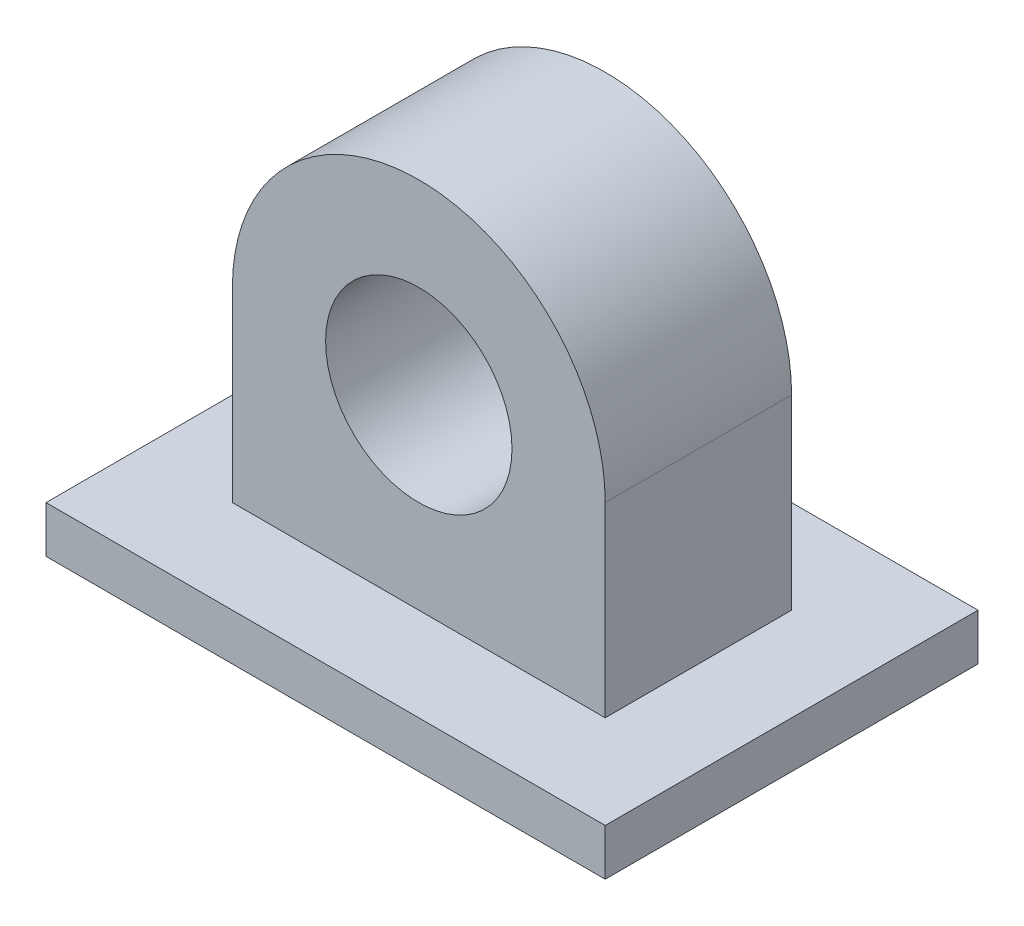
ISO-10303-21;
HEADER;
FILE_DESCRIPTION(('STEP AP214'),'2;1');
FILE_NAME('part.step','',(''),(''),'','','');
FILE_SCHEMA(('AUTOMOTIVE_DESIGN { 1 0 10303 214 1 1 1 1 }'));
ENDSEC;
DATA;
#1=APPLICATION_CONTEXT('core data for automotive mechanical design processes');
#2=APPLICATION_PROTOCOL_DEFINITION('international standard','automotive_design',2000,#1);
#3=PRODUCT_CONTEXT('',#1,'mechanical');
#4=PRODUCT('Part','Part','',(#3));
#5=PRODUCT_RELATED_PRODUCT_CATEGORY('part','',(#4));
#6=PRODUCT_DEFINITION_FORMATION('','',#4);
#7=PRODUCT_DEFINITION_CONTEXT('part definition',#1,'design');
#8=PRODUCT_DEFINITION('design','',#6,#7);
#9=PRODUCT_DEFINITION_SHAPE('','',#8);
#10=(LENGTH_UNIT() NAMED_UNIT(*) SI_UNIT(.MILLI.,.METRE.));
#11=(NAMED_UNIT(*) PLANE_ANGLE_UNIT() SI_UNIT($,.RADIAN.));
#12=(NAMED_UNIT(*) SI_UNIT($,.STERADIAN.) SOLID_ANGLE_UNIT());
#13=UNCERTAINTY_MEASURE_WITH_UNIT(LENGTH_MEASURE(1.E-05),#10,'distance_accuracy_value','');
#14=(GEOMETRIC_REPRESENTATION_CONTEXT(3) GLOBAL_UNCERTAINTY_ASSIGNED_CONTEXT((#13)) GLOBAL_UNIT_ASSIGNED_CONTEXT((#10,
#11,#12)) REPRESENTATION_CONTEXT('',''));
#15=CARTESIAN_POINT('',(0.,0.,0.));
#16=DIRECTION('',(0.,0.,1.));
#17=DIRECTION('',(1.,0.,0.));
#18=AXIS2_PLACEMENT_3D('',#15,#16,#17);
#19=CARTESIAN_POINT('',(38.1,6.35,25.4));
#20=DIRECTION('',(-1.,0.,0.));
#21=DIRECTION('',(0.,0.,1.));
#22=AXIS2_PLACEMENT_3D('',#19,#20,#21);
#23=PLANE('',#22);
#24=DIRECTION('',(0.,0.,-1.));
#25=VECTOR('',#24,1.);
#26=CARTESIAN_POINT('',(38.1,0.,25.4));
#27=LINE('',#26,#25);
#28=CARTESIAN_POINT('',(38.1,0.,25.4));
#29=VERTEX_POINT('',#28);
#30=CARTESIAN_POINT('',(38.1,0.,-25.4));
#31=VERTEX_POINT('',#30);
#32=EDGE_CURVE('E107',#29,#31,#27,.T.);
#33=ORIENTED_EDGE('',*,*,#32,.T.);
#34=DIRECTION('',(0.,-1.,0.));
#35=VECTOR('',#34,1.);
#36=CARTESIAN_POINT('',(38.1,6.35,-25.4));
#37=LINE('',#36,#35);
#38=CARTESIAN_POINT('',(38.1,6.35,-25.4));
#39=VERTEX_POINT('',#38);
#40=EDGE_CURVE('E11',#39,#31,#37,.T.);
#41=ORIENTED_EDGE('',*,*,#40,.F.);
#42=DIRECTION('',(0.,0.,-1.));
#43=VECTOR('',#42,1.);
#44=CARTESIAN_POINT('',(38.1,6.35,25.4));
#45=LINE('',#44,#43);
#46=CARTESIAN_POINT('',(38.1,6.35,25.4));
#47=VERTEX_POINT('',#46);
#48=EDGE_CURVE('E136',#47,#39,#45,.T.);
#49=ORIENTED_EDGE('',*,*,#48,.F.);
#50=DIRECTION('',(0.,-1.,0.));
#51=VECTOR('',#50,1.);
#52=CARTESIAN_POINT('',(38.1,6.35,25.4));
#53=LINE('',#52,#51);
#54=EDGE_CURVE('E146',#47,#29,#53,.T.);
#55=ORIENTED_EDGE('',*,*,#54,.T.);
#56=EDGE_LOOP('',(#33,#41,#49,#55));
#57=FACE_BOUND('',#56,.T.);
#58=ADVANCED_FACE('F34',(#57),#23,.F.);
#59=CARTESIAN_POINT('',(-38.1,6.35,-25.4));
#60=DIRECTION('',(0.,0.,1.));
#61=DIRECTION('',(1.,0.,0.));
#62=AXIS2_PLACEMENT_3D('',#59,#60,#61);
#63=PLANE('',#62);
#64=DIRECTION('',(-1.,0.,0.));
#65=VECTOR('',#64,1.);
#66=CARTESIAN_POINT('',(-38.1,0.,-25.4));
#67=LINE('',#66,#65);
#68=CARTESIAN_POINT('',(-38.1,0.,-25.4));
#69=VERTEX_POINT('',#68);
#70=EDGE_CURVE('E149',#31,#69,#67,.T.);
#71=ORIENTED_EDGE('',*,*,#70,.T.);
#72=DIRECTION('',(0.,-1.,0.));
#73=VECTOR('',#72,1.);
#74=CARTESIAN_POINT('',(-38.1,6.35,-25.4));
#75=LINE('',#74,#73);
#76=CARTESIAN_POINT('',(-38.1,6.35,-25.4));
#77=VERTEX_POINT('',#76);
#78=EDGE_CURVE('E42',#77,#69,#75,.T.);
#79=ORIENTED_EDGE('',*,*,#78,.F.);
#80=DIRECTION('',(-1.,0.,0.));
#81=VECTOR('',#80,1.);
#82=CARTESIAN_POINT('',(-38.1,6.35,-25.4));
#83=LINE('',#82,#81);
#84=EDGE_CURVE('E139',#39,#77,#83,.T.);
#85=ORIENTED_EDGE('',*,*,#84,.F.);
#86=ORIENTED_EDGE('',*,*,#40,.T.);
#87=EDGE_LOOP('',(#71,#79,#85,#86));
#88=FACE_BOUND('',#87,.T.);
#89=ADVANCED_FACE('F180',(#88),#63,.F.);
#90=CARTESIAN_POINT('',(-38.1,6.35,25.4));
#91=DIRECTION('',(1.,0.,0.));
#92=DIRECTION('',(0.,0.,-1.));
#93=AXIS2_PLACEMENT_3D('',#90,#91,#92);
#94=PLANE('',#93);
#95=DIRECTION('',(0.,0.,1.));
#96=VECTOR('',#95,1.);
#97=CARTESIAN_POINT('',(-38.1,0.,25.4));
#98=LINE('',#97,#96);
#99=CARTESIAN_POINT('',(-38.1,0.,25.4));
#100=VERTEX_POINT('',#99);
#101=EDGE_CURVE('E151',#69,#100,#98,.T.);
#102=ORIENTED_EDGE('',*,*,#101,.T.);
#103=DIRECTION('',(0.,-1.,0.));
#104=VECTOR('',#103,1.);
#105=CARTESIAN_POINT('',(-38.1,6.35,25.4));
#106=LINE('',#105,#104);
#107=CARTESIAN_POINT('',(-38.1,6.35,25.4));
#108=VERTEX_POINT('',#107);
#109=EDGE_CURVE('E156',#108,#100,#106,.T.);
#110=ORIENTED_EDGE('',*,*,#109,.F.);
#111=DIRECTION('',(0.,0.,1.));
#112=VECTOR('',#111,1.);
#113=CARTESIAN_POINT('',(-38.1,6.35,25.4));
#114=LINE('',#113,#112);
#115=EDGE_CURVE('E142',#77,#108,#114,.T.);
#116=ORIENTED_EDGE('',*,*,#115,.F.);
#117=ORIENTED_EDGE('',*,*,#78,.T.);
#118=EDGE_LOOP('',(#102,#110,#116,#117));
#119=FACE_BOUND('',#118,.T.);
#120=ADVANCED_FACE('F164',(#119),#94,.F.);
#121=CARTESIAN_POINT('',(-38.1,6.35,25.4));
#122=DIRECTION('',(0.,0.,-1.));
#123=DIRECTION('',(-1.,0.,0.));
#124=AXIS2_PLACEMENT_3D('',#121,#122,#123);
#125=PLANE('',#124);
#126=DIRECTION('',(1.,0.,0.));
#127=VECTOR('',#126,1.);
#128=CARTESIAN_POINT('',(-38.1,0.,25.4));
#129=LINE('',#128,#127);
#130=EDGE_CURVE('E140',#100,#29,#129,.T.);
#131=ORIENTED_EDGE('',*,*,#130,.T.);
#132=ORIENTED_EDGE('',*,*,#54,.F.);
#133=DIRECTION('',(1.,0.,0.));
#134=VECTOR('',#133,1.);
#135=CARTESIAN_POINT('',(-38.1,6.35,25.4));
#136=LINE('',#135,#134);
#137=EDGE_CURVE('E144',#108,#47,#136,.T.);
#138=ORIENTED_EDGE('',*,*,#137,.F.);
#139=ORIENTED_EDGE('',*,*,#109,.T.);
#140=EDGE_LOOP('',(#131,#132,#138,#139));
#141=FACE_BOUND('',#140,.T.);
#142=ADVANCED_FACE('F173',(#141),#125,.F.);
#143=CARTESIAN_POINT('',(0.,6.35,0.));
#144=DIRECTION('',(0.,-1.,0.));
#145=DIRECTION('',(0.,0.,-1.));
#146=AXIS2_PLACEMENT_3D('',#143,#144,#145);
#147=PLANE('',#146);
#148=DIRECTION('',(0.,0.,-1.));
#149=VECTOR('',#148,1.);
#150=CARTESIAN_POINT('',(25.4,6.35,12.7));
#151=LINE('',#150,#149);
#152=CARTESIAN_POINT('',(25.4,6.35,12.7));
#153=VERTEX_POINT('',#152);
#154=CARTESIAN_POINT('',(25.4,6.35,-12.7));
#155=VERTEX_POINT('',#154);
#156=EDGE_CURVE('E54',#153,#155,#151,.T.);
#157=ORIENTED_EDGE('',*,*,#156,.F.);
#158=DIRECTION('',(1.,0.,0.));
#159=VECTOR('',#158,1.);
#160=CARTESIAN_POINT('',(0.,6.35,12.7));
#161=LINE('',#160,#159);
#162=CARTESIAN_POINT('',(-25.4,6.35,12.7));
#163=VERTEX_POINT('',#162);
#164=EDGE_CURVE('E49',#163,#153,#161,.T.);
#165=ORIENTED_EDGE('',*,*,#164,.F.);
#166=DIRECTION('',(0.,0.,-1.));
#167=VECTOR('',#166,1.);
#168=CARTESIAN_POINT('',(-25.4,6.35,12.7));
#169=LINE('',#168,#167);
#170=CARTESIAN_POINT('',(-25.4,6.35,-12.7));
#171=VERTEX_POINT('',#170);
#172=EDGE_CURVE('E108',#163,#171,#169,.T.);
#173=ORIENTED_EDGE('',*,*,#172,.T.);
#174=DIRECTION('',(1.,0.,0.));
#175=VECTOR('',#174,1.);
#176=CARTESIAN_POINT('',(0.,6.35,-12.7));
#177=LINE('',#176,#175);
#178=EDGE_CURVE('E129',#171,#155,#177,.T.);
#179=ORIENTED_EDGE('',*,*,#178,.T.);
#180=EDGE_LOOP('',(#157,#165,#173,#179));
#181=FACE_BOUND('',#180,.T.);
#182=ORIENTED_EDGE('',*,*,#48,.T.);
#183=ORIENTED_EDGE('',*,*,#84,.T.);
#184=ORIENTED_EDGE('',*,*,#115,.T.);
#185=ORIENTED_EDGE('',*,*,#137,.T.);
#186=EDGE_LOOP('',(#182,#183,#184,#185));
#187=FACE_BOUND('',#186,.T.);
#188=ADVANCED_FACE('F179',(#181,#187),#147,.F.);
#189=CARTESIAN_POINT('',(0.,0.,0.));
#190=DIRECTION('',(0.,-1.,0.));
#191=DIRECTION('',(0.,0.,-1.));
#192=AXIS2_PLACEMENT_3D('',#189,#190,#191);
#193=PLANE('',#192);
#194=ORIENTED_EDGE('',*,*,#32,.F.);
#195=ORIENTED_EDGE('',*,*,#130,.F.);
#196=ORIENTED_EDGE('',*,*,#101,.F.);
#197=ORIENTED_EDGE('',*,*,#70,.F.);
#198=EDGE_LOOP('',(#194,#195,#196,#197));
#199=FACE_BOUND('',#198,.T.);
#200=ADVANCED_FACE('F170',(#199),#193,.T.);
#201=CARTESIAN_POINT('',(0.,31.75,12.7));
#202=DIRECTION('',(0.,0.,-1.));
#203=DIRECTION('',(-1.,0.,0.));
#204=AXIS2_PLACEMENT_3D('',#201,#202,#203);
#205=CYLINDRICAL_SURFACE('',#204,25.4);
#206=CARTESIAN_POINT('',(0.,31.75,-12.7));
#207=DIRECTION('',(0.,0.,1.));
#208=DIRECTION('',(1.,0.,0.));
#209=AXIS2_PLACEMENT_3D('',#206,#207,#208);
#210=CIRCLE('',#209,25.4);
#211=CARTESIAN_POINT('',(-25.4,31.75,-12.7));
#212=VERTEX_POINT('',#211);
#213=CARTESIAN_POINT('',(25.4,31.75,-12.7));
#214=VERTEX_POINT('',#213);
#215=EDGE_CURVE('E102',#212,#214,#210,.F.);
#216=ORIENTED_EDGE('',*,*,#215,.F.);
#217=DIRECTION('',(0.,0.,-1.));
#218=VECTOR('',#217,1.);
#219=CARTESIAN_POINT('',(-25.4,31.75,12.7));
#220=LINE('',#219,#218);
#221=CARTESIAN_POINT('',(-25.4,31.75,12.7));
#222=VERTEX_POINT('',#221);
#223=EDGE_CURVE('E97',#222,#212,#220,.T.);
#224=ORIENTED_EDGE('',*,*,#223,.F.);
#225=CARTESIAN_POINT('',(0.,31.75,12.7));
#226=DIRECTION('',(0.,0.,1.));
#227=DIRECTION('',(1.,0.,0.));
#228=AXIS2_PLACEMENT_3D('',#225,#226,#227);
#229=CIRCLE('',#228,25.4);
#230=CARTESIAN_POINT('',(25.4,31.75,12.7));
#231=VERTEX_POINT('',#230);
#232=EDGE_CURVE('E100',#222,#231,#229,.F.);
#233=ORIENTED_EDGE('',*,*,#232,.T.);
#234=DIRECTION('',(0.,0.,-1.));
#235=VECTOR('',#234,1.);
#236=CARTESIAN_POINT('',(25.4,31.75,12.7));
#237=LINE('',#236,#235);
#238=EDGE_CURVE('E125',#231,#214,#237,.T.);
#239=ORIENTED_EDGE('',*,*,#238,.T.);
#240=EDGE_LOOP('',(#216,#224,#233,#239));
#241=FACE_BOUND('',#240,.T.);
#242=ADVANCED_FACE('F99',(#241),#205,.T.);
#243=CARTESIAN_POINT('',(-25.4,0.,12.7));
#244=DIRECTION('',(-1.,0.,0.));
#245=DIRECTION('',(0.,0.,1.));
#246=AXIS2_PLACEMENT_3D('',#243,#244,#245);
#247=PLANE('',#246);
#248=DIRECTION('',(0.,1.,0.));
#249=VECTOR('',#248,1.);
#250=CARTESIAN_POINT('',(-25.4,0.,-12.7));
#251=LINE('',#250,#249);
#252=EDGE_CURVE('E127',#171,#212,#251,.T.);
#253=ORIENTED_EDGE('',*,*,#252,.F.);
#254=ORIENTED_EDGE('',*,*,#172,.F.);
#255=DIRECTION('',(0.,1.,0.));
#256=VECTOR('',#255,1.);
#257=CARTESIAN_POINT('',(-25.4,0.,12.7));
#258=LINE('',#257,#256);
#259=EDGE_CURVE('E113',#163,#222,#258,.T.);
#260=ORIENTED_EDGE('',*,*,#259,.T.);
#261=ORIENTED_EDGE('',*,*,#223,.T.);
#262=EDGE_LOOP('',(#253,#254,#260,#261));
#263=FACE_BOUND('',#262,.T.);
#264=ADVANCED_FACE('F119',(#263),#247,.T.);
#265=CARTESIAN_POINT('',(25.4,0.,12.7));
#266=DIRECTION('',(-1.,0.,0.));
#267=DIRECTION('',(0.,0.,1.));
#268=AXIS2_PLACEMENT_3D('',#265,#266,#267);
#269=PLANE('',#268);
#270=DIRECTION('',(0.,1.,0.));
#271=VECTOR('',#270,1.);
#272=CARTESIAN_POINT('',(25.4,0.,-12.7));
#273=LINE('',#272,#271);
#274=EDGE_CURVE('E117',#155,#214,#273,.T.);
#275=ORIENTED_EDGE('',*,*,#274,.T.);
#276=ORIENTED_EDGE('',*,*,#238,.F.);
#277=DIRECTION('',(0.,1.,0.));
#278=VECTOR('',#277,1.);
#279=CARTESIAN_POINT('',(25.4,0.,12.7));
#280=LINE('',#279,#278);
#281=EDGE_CURVE('E115',#153,#231,#280,.T.);
#282=ORIENTED_EDGE('',*,*,#281,.F.);
#283=ORIENTED_EDGE('',*,*,#156,.T.);
#284=EDGE_LOOP('',(#275,#276,#282,#283));
#285=FACE_BOUND('',#284,.T.);
#286=ADVANCED_FACE('F198',(#285),#269,.F.);
#287=CARTESIAN_POINT('',(0.,0.,12.7));
#288=DIRECTION('',(0.,0.,1.));
#289=DIRECTION('',(1.,0.,0.));
#290=AXIS2_PLACEMENT_3D('',#287,#288,#289);
#291=PLANE('',#290);
#292=CARTESIAN_POINT('',(0.,31.75,12.7));
#293=DIRECTION('',(0.,0.,1.));
#294=DIRECTION('',(1.,0.,0.));
#295=AXIS2_PLACEMENT_3D('',#292,#293,#294);
#296=CIRCLE('',#295,12.7);
#297=CARTESIAN_POINT('',(12.7,31.75,12.7));
#298=VERTEX_POINT('',#297);
#299=EDGE_CURVE('E217',#298,#298,#296,.T.);
#300=ORIENTED_EDGE('',*,*,#299,.F.);
#301=EDGE_LOOP('',(#300));
#302=FACE_BOUND('',#301,.T.);
#303=ORIENTED_EDGE('',*,*,#232,.F.);
#304=ORIENTED_EDGE('',*,*,#259,.F.);
#305=ORIENTED_EDGE('',*,*,#164,.T.);
#306=ORIENTED_EDGE('',*,*,#281,.T.);
#307=EDGE_LOOP('',(#303,#304,#305,#306));
#308=FACE_BOUND('',#307,.T.);
#309=ADVANCED_FACE('F112',(#302,#308),#291,.T.);
#310=CARTESIAN_POINT('',(0.,0.,-12.7));
#311=DIRECTION('',(0.,0.,1.));
#312=DIRECTION('',(1.,0.,0.));
#313=AXIS2_PLACEMENT_3D('',#310,#311,#312);
#314=PLANE('',#313);
#315=CARTESIAN_POINT('',(0.,31.75,-12.7));
#316=DIRECTION('',(0.,0.,1.));
#317=DIRECTION('',(1.,0.,0.));
#318=AXIS2_PLACEMENT_3D('',#315,#316,#317);
#319=CIRCLE('',#318,12.7);
#320=CARTESIAN_POINT('',(12.7,31.75,-12.7));
#321=VERTEX_POINT('',#320);
#322=EDGE_CURVE('E37',#321,#321,#319,.T.);
#323=ORIENTED_EDGE('',*,*,#322,.T.);
#324=EDGE_LOOP('',(#323));
#325=FACE_BOUND('',#324,.T.);
#326=ORIENTED_EDGE('',*,*,#215,.T.);
#327=ORIENTED_EDGE('',*,*,#274,.F.);
#328=ORIENTED_EDGE('',*,*,#178,.F.);
#329=ORIENTED_EDGE('',*,*,#252,.T.);
#330=EDGE_LOOP('',(#326,#327,#328,#329));
#331=FACE_BOUND('',#330,.T.);
#332=ADVANCED_FACE('F202',(#325,#331),#314,.F.);
#333=CARTESIAN_POINT('',(0.,31.75,-25.4));
#334=DIRECTION('',(0.,0.,1.));
#335=DIRECTION('',(1.,0.,0.));
#336=AXIS2_PLACEMENT_3D('',#333,#334,#335);
#337=CYLINDRICAL_SURFACE('',#336,12.7);
#338=ORIENTED_EDGE('',*,*,#299,.T.);
#339=EDGE_LOOP('',(#338));
#340=FACE_BOUND('',#339,.T.);
#341=ORIENTED_EDGE('',*,*,#322,.F.);
#342=EDGE_LOOP('',(#341));
#343=FACE_BOUND('',#342,.T.);
#344=ADVANCED_FACE('F205',(#340,#343),#337,.F.);
#345=CLOSED_SHELL('',(#58,#89,#120,#142,#188,#200,#242,#264,#286,#309,#332,#344));
#346=MANIFOLD_SOLID_BREP('B2',#345);
#347=ADVANCED_BREP_SHAPE_REPRESENTATION('',(#18,#346),#14);
#348=SHAPE_DEFINITION_REPRESENTATION(#9,#347);
ENDSEC;
END-ISO-10303-21;
